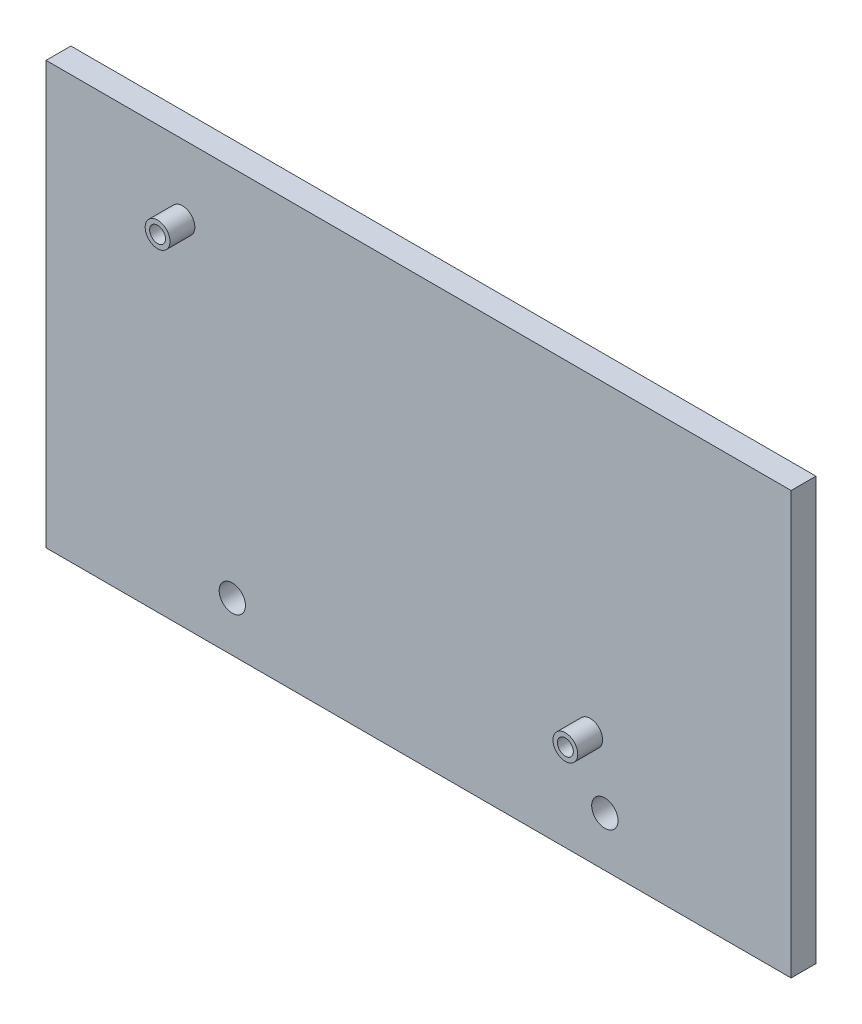
ISO-10303-21;
HEADER;
FILE_DESCRIPTION(('STEP AP214'),'2;1');
FILE_NAME('part.step','',(''),(''),'','','');
FILE_SCHEMA(('AUTOMOTIVE_DESIGN { 1 0 10303 214 1 1 1 1 }'));
ENDSEC;
DATA;
#1=APPLICATION_CONTEXT('core data for automotive mechanical design processes');
#2=APPLICATION_PROTOCOL_DEFINITION('international standard','automotive_design',2000,#1);
#3=PRODUCT_CONTEXT('',#1,'mechanical');
#4=PRODUCT('Part','Part','',(#3));
#5=PRODUCT_RELATED_PRODUCT_CATEGORY('part','',(#4));
#6=PRODUCT_DEFINITION_FORMATION('','',#4);
#7=PRODUCT_DEFINITION_CONTEXT('part definition',#1,'design');
#8=PRODUCT_DEFINITION('design','',#6,#7);
#9=PRODUCT_DEFINITION_SHAPE('','',#8);
#10=(LENGTH_UNIT() NAMED_UNIT(*) SI_UNIT(.MILLI.,.METRE.));
#11=(NAMED_UNIT(*) PLANE_ANGLE_UNIT() SI_UNIT($,.RADIAN.));
#12=(NAMED_UNIT(*) SI_UNIT($,.STERADIAN.) SOLID_ANGLE_UNIT());
#13=UNCERTAINTY_MEASURE_WITH_UNIT(LENGTH_MEASURE(1.E-05),#10,'distance_accuracy_value','');
#14=(GEOMETRIC_REPRESENTATION_CONTEXT(3) GLOBAL_UNCERTAINTY_ASSIGNED_CONTEXT((#13)) GLOBAL_UNIT_ASSIGNED_CONTEXT((#10,
#11,#12)) REPRESENTATION_CONTEXT('',''));
#15=CARTESIAN_POINT('',(0.,0.,0.));
#16=DIRECTION('',(0.,0.,1.));
#17=DIRECTION('',(1.,0.,0.));
#18=AXIS2_PLACEMENT_3D('',#15,#16,#17);
#19=CARTESIAN_POINT('',(109.549409347039,22.54,0.));
#20=DIRECTION('',(0.,0.,1.));
#21=DIRECTION('',(1.,0.,0.));
#22=AXIS2_PLACEMENT_3D('',#19,#20,#21);
#23=CYLINDRICAL_SURFACE('',#22,1.6);
#24=CARTESIAN_POINT('',(109.549409347039,22.54,10.));
#25=DIRECTION('',(0.,0.,1.));
#26=DIRECTION('',(1.,0.,0.));
#27=AXIS2_PLACEMENT_3D('',#24,#25,#26);
#28=CIRCLE('',#27,1.6);
#29=CARTESIAN_POINT('',(111.149409347039,22.54,10.));
#30=VERTEX_POINT('',#29);
#31=EDGE_CURVE('E207',#30,#30,#28,.T.);
#32=ORIENTED_EDGE('',*,*,#31,.T.);
#33=EDGE_LOOP('',(#32));
#34=FACE_BOUND('',#33,.T.);
#35=CARTESIAN_POINT('',(109.549409347039,22.54,3.2));
#36=DIRECTION('',(0.,0.,-1.));
#37=DIRECTION('',(-1.,0.,0.));
#38=AXIS2_PLACEMENT_3D('',#35,#36,#37);
#39=CIRCLE('',#38,1.6);
#40=CARTESIAN_POINT('',(107.949409347039,22.54,3.2));
#41=VERTEX_POINT('',#40);
#42=EDGE_CURVE('E193',#41,#41,#39,.T.);
#43=ORIENTED_EDGE('',*,*,#42,.T.);
#44=EDGE_LOOP('',(#43));
#45=FACE_BOUND('',#44,.T.);
#46=ADVANCED_FACE('F69',(#34,#45),#23,.F.);
#47=CARTESIAN_POINT('',(27.4544,70.8761999999999,0.));
#48=DIRECTION('',(0.,0.,1.));
#49=DIRECTION('',(1.,0.,0.));
#50=AXIS2_PLACEMENT_3D('',#47,#48,#49);
#51=CYLINDRICAL_SURFACE('',#50,1.6);
#52=CARTESIAN_POINT('',(27.4544,70.8761999999999,10.));
#53=DIRECTION('',(0.,0.,1.));
#54=DIRECTION('',(1.,0.,0.));
#55=AXIS2_PLACEMENT_3D('',#52,#53,#54);
#56=CIRCLE('',#55,1.60000000000001);
#57=CARTESIAN_POINT('',(29.0544000000001,70.8761999999999,10.));
#58=VERTEX_POINT('',#57);
#59=EDGE_CURVE('E213',#58,#58,#56,.T.);
#60=ORIENTED_EDGE('',*,*,#59,.T.);
#61=EDGE_LOOP('',(#60));
#62=FACE_BOUND('',#61,.T.);
#63=CARTESIAN_POINT('',(27.4544,70.8761999999999,3.2));
#64=DIRECTION('',(0.,0.,-1.));
#65=DIRECTION('',(-1.,0.,0.));
#66=AXIS2_PLACEMENT_3D('',#63,#64,#65);
#67=CIRCLE('',#66,1.60000000000001);
#68=CARTESIAN_POINT('',(25.8544,70.8761999999999,3.2));
#69=VERTEX_POINT('',#68);
#70=EDGE_CURVE('E197',#69,#69,#67,.T.);
#71=ORIENTED_EDGE('',*,*,#70,.T.);
#72=EDGE_LOOP('',(#71));
#73=FACE_BOUND('',#72,.T.);
#74=ADVANCED_FACE('F158',(#62,#73),#51,.F.);
#75=CARTESIAN_POINT('',(0.,0.,5.));
#76=DIRECTION('',(0.,0.,1.));
#77=DIRECTION('',(1.,0.,0.));
#78=AXIS2_PLACEMENT_3D('',#75,#76,#77);
#79=PLANE('',#78);
#80=CARTESIAN_POINT('',(27.4544,70.8761999999999,5.));
#81=DIRECTION('',(0.,0.,1.));
#82=DIRECTION('',(1.,0.,0.));
#83=AXIS2_PLACEMENT_3D('',#80,#81,#82);
#84=CIRCLE('',#83,2.5);
#85=CARTESIAN_POINT('',(29.9544,70.8761999999999,5.));
#86=VERTEX_POINT('',#85);
#87=EDGE_CURVE('E216',#86,#86,#84,.T.);
#88=ORIENTED_EDGE('',*,*,#87,.F.);
#89=EDGE_LOOP('',(#88));
#90=FACE_BOUND('',#89,.T.);
#91=CARTESIAN_POINT('',(37.5,10.,5.));
#92=DIRECTION('',(0.,0.,1.));
#93=DIRECTION('',(1.,0.,0.));
#94=AXIS2_PLACEMENT_3D('',#91,#92,#93);
#95=CIRCLE('',#94,2.65);
#96=CARTESIAN_POINT('',(40.15,10.,5.));
#97=VERTEX_POINT('',#96);
#98=EDGE_CURVE('E140',#97,#97,#95,.T.);
#99=ORIENTED_EDGE('',*,*,#98,.F.);
#100=EDGE_LOOP('',(#99));
#101=FACE_BOUND('',#100,.T.);
#102=DIRECTION('',(1.,0.,0.));
#103=VECTOR('',#102,1.);
#104=CARTESIAN_POINT('',(0.,85.,5.));
#105=LINE('',#104,#103);
#106=CARTESIAN_POINT('',(0.,85.,5.));
#107=VERTEX_POINT('',#106);
#108=CARTESIAN_POINT('',(150.,85.,5.));
#109=VERTEX_POINT('',#108);
#110=EDGE_CURVE('E129',#107,#109,#105,.T.);
#111=ORIENTED_EDGE('',*,*,#110,.F.);
#112=DIRECTION('',(0.,1.,0.));
#113=VECTOR('',#112,1.);
#114=CARTESIAN_POINT('',(0.,0.,5.));
#115=LINE('',#114,#113);
#116=CARTESIAN_POINT('',(0.,0.,5.));
#117=VERTEX_POINT('',#116);
#118=EDGE_CURVE('E119',#117,#107,#115,.T.);
#119=ORIENTED_EDGE('',*,*,#118,.F.);
#120=DIRECTION('',(1.,0.,0.));
#121=VECTOR('',#120,1.);
#122=CARTESIAN_POINT('',(0.,0.,5.));
#123=LINE('',#122,#121);
#124=CARTESIAN_POINT('',(150.,0.,5.));
#125=VERTEX_POINT('',#124);
#126=EDGE_CURVE('E115',#117,#125,#123,.T.);
#127=ORIENTED_EDGE('',*,*,#126,.T.);
#128=DIRECTION('',(0.,1.,0.));
#129=VECTOR('',#128,1.);
#130=CARTESIAN_POINT('',(150.,0.,5.));
#131=LINE('',#130,#129);
#132=EDGE_CURVE('E112',#125,#109,#131,.T.);
#133=ORIENTED_EDGE('',*,*,#132,.T.);
#134=EDGE_LOOP('',(#111,#119,#127,#133));
#135=FACE_BOUND('',#134,.T.);
#136=CARTESIAN_POINT('',(112.5,10.,5.));
#137=DIRECTION('',(0.,0.,1.));
#138=DIRECTION('',(1.,0.,0.));
#139=AXIS2_PLACEMENT_3D('',#136,#137,#138);
#140=CIRCLE('',#139,2.65);
#141=CARTESIAN_POINT('',(115.15,10.,5.));
#142=VERTEX_POINT('',#141);
#143=EDGE_CURVE('E223',#142,#142,#140,.T.);
#144=ORIENTED_EDGE('',*,*,#143,.F.);
#145=EDGE_LOOP('',(#144));
#146=FACE_BOUND('',#145,.T.);
#147=CARTESIAN_POINT('',(109.549409347039,22.54,5.));
#148=DIRECTION('',(0.,0.,1.));
#149=DIRECTION('',(1.,0.,0.));
#150=AXIS2_PLACEMENT_3D('',#147,#148,#149);
#151=CIRCLE('',#150,2.5);
#152=CARTESIAN_POINT('',(112.049409347039,22.54,5.));
#153=VERTEX_POINT('',#152);
#154=EDGE_CURVE('E204',#153,#153,#151,.T.);
#155=ORIENTED_EDGE('',*,*,#154,.F.);
#156=EDGE_LOOP('',(#155));
#157=FACE_BOUND('',#156,.T.);
#158=ADVANCED_FACE('F117',(#90,#101,#135,#146,#157),#79,.T.);
#159=CARTESIAN_POINT('',(0.,0.,0.));
#160=DIRECTION('',(0.,0.,1.));
#161=DIRECTION('',(1.,0.,0.));
#162=AXIS2_PLACEMENT_3D('',#159,#160,#161);
#163=PLANE('',#162);
#164=CARTESIAN_POINT('',(27.4544,70.8761999999999,0.));
#165=DIRECTION('',(0.,0.,-1.));
#166=DIRECTION('',(-1.,0.,0.));
#167=AXIS2_PLACEMENT_3D('',#164,#165,#166);
#168=CIRCLE('',#167,3.);
#169=CARTESIAN_POINT('',(24.4544,70.8761999999999,0.));
#170=VERTEX_POINT('',#169);
#171=EDGE_CURVE('E188',#170,#170,#168,.T.);
#172=ORIENTED_EDGE('',*,*,#171,.F.);
#173=EDGE_LOOP('',(#172));
#174=FACE_BOUND('',#173,.T.);
#175=CARTESIAN_POINT('',(109.549409347039,22.54,0.));
#176=DIRECTION('',(0.,0.,-1.));
#177=DIRECTION('',(-1.,0.,0.));
#178=AXIS2_PLACEMENT_3D('',#175,#176,#177);
#179=CIRCLE('',#178,3.00000000000001);
#180=CARTESIAN_POINT('',(106.549409347039,22.54,0.));
#181=VERTEX_POINT('',#180);
#182=EDGE_CURVE('E191',#181,#181,#179,.T.);
#183=ORIENTED_EDGE('',*,*,#182,.F.);
#184=EDGE_LOOP('',(#183));
#185=FACE_BOUND('',#184,.T.);
#186=DIRECTION('',(1.,0.,0.));
#187=VECTOR('',#186,1.);
#188=CARTESIAN_POINT('',(0.,85.,0.));
#189=LINE('',#188,#187);
#190=CARTESIAN_POINT('',(0.,85.,0.));
#191=VERTEX_POINT('',#190);
#192=CARTESIAN_POINT('',(150.,85.,0.));
#193=VERTEX_POINT('',#192);
#194=EDGE_CURVE('E136',#191,#193,#189,.T.);
#195=ORIENTED_EDGE('',*,*,#194,.T.);
#196=DIRECTION('',(0.,1.,0.));
#197=VECTOR('',#196,1.);
#198=CARTESIAN_POINT('',(150.,0.,0.));
#199=LINE('',#198,#197);
#200=CARTESIAN_POINT('',(150.,0.,0.));
#201=VERTEX_POINT('',#200);
#202=EDGE_CURVE('E139',#201,#193,#199,.T.);
#203=ORIENTED_EDGE('',*,*,#202,.F.);
#204=DIRECTION('',(1.,0.,0.));
#205=VECTOR('',#204,1.);
#206=CARTESIAN_POINT('',(0.,0.,0.));
#207=LINE('',#206,#205);
#208=CARTESIAN_POINT('',(0.,0.,0.));
#209=VERTEX_POINT('',#208);
#210=EDGE_CURVE('E124',#209,#201,#207,.T.);
#211=ORIENTED_EDGE('',*,*,#210,.F.);
#212=DIRECTION('',(0.,1.,0.));
#213=VECTOR('',#212,1.);
#214=CARTESIAN_POINT('',(0.,0.,0.));
#215=LINE('',#214,#213);
#216=EDGE_CURVE('E131',#209,#191,#215,.T.);
#217=ORIENTED_EDGE('',*,*,#216,.T.);
#218=EDGE_LOOP('',(#195,#203,#211,#217));
#219=FACE_BOUND('',#218,.T.);
#220=CARTESIAN_POINT('',(37.5,10.,0.));
#221=DIRECTION('',(0.,0.,1.));
#222=DIRECTION('',(1.,0.,0.));
#223=AXIS2_PLACEMENT_3D('',#220,#221,#222);
#224=CIRCLE('',#223,2.65);
#225=CARTESIAN_POINT('',(40.15,10.,0.));
#226=VERTEX_POINT('',#225);
#227=EDGE_CURVE('E226',#226,#226,#224,.T.);
#228=ORIENTED_EDGE('',*,*,#227,.T.);
#229=EDGE_LOOP('',(#228));
#230=FACE_BOUND('',#229,.T.);
#231=CARTESIAN_POINT('',(112.5,10.,0.));
#232=DIRECTION('',(0.,0.,1.));
#233=DIRECTION('',(1.,0.,0.));
#234=AXIS2_PLACEMENT_3D('',#231,#232,#233);
#235=CIRCLE('',#234,2.65);
#236=CARTESIAN_POINT('',(115.15,10.,0.));
#237=VERTEX_POINT('',#236);
#238=EDGE_CURVE('E220',#237,#237,#235,.T.);
#239=ORIENTED_EDGE('',*,*,#238,.T.);
#240=EDGE_LOOP('',(#239));
#241=FACE_BOUND('',#240,.T.);
#242=ADVANCED_FACE('F146',(#174,#185,#219,#230,#241),#163,.F.);
#243=CARTESIAN_POINT('',(0.,85.,5.));
#244=DIRECTION('',(0.,1.,0.));
#245=DIRECTION('',(0.,0.,1.));
#246=AXIS2_PLACEMENT_3D('',#243,#244,#245);
#247=PLANE('',#246);
#248=ORIENTED_EDGE('',*,*,#194,.F.);
#249=DIRECTION('',(0.,0.,-1.));
#250=VECTOR('',#249,1.);
#251=CARTESIAN_POINT('',(0.,85.,5.));
#252=LINE('',#251,#250);
#253=EDGE_CURVE('E12',#107,#191,#252,.T.);
#254=ORIENTED_EDGE('',*,*,#253,.F.);
#255=ORIENTED_EDGE('',*,*,#110,.T.);
#256=DIRECTION('',(0.,0.,-1.));
#257=VECTOR('',#256,1.);
#258=CARTESIAN_POINT('',(150.,85.,5.));
#259=LINE('',#258,#257);
#260=EDGE_CURVE('E73',#109,#193,#259,.T.);
#261=ORIENTED_EDGE('',*,*,#260,.T.);
#262=EDGE_LOOP('',(#248,#254,#255,#261));
#263=FACE_BOUND('',#262,.T.);
#264=ADVANCED_FACE('F71',(#263),#247,.T.);
#265=CARTESIAN_POINT('',(0.,0.,5.));
#266=DIRECTION('',(-1.,0.,0.));
#267=DIRECTION('',(0.,0.,1.));
#268=AXIS2_PLACEMENT_3D('',#265,#266,#267);
#269=PLANE('',#268);
#270=ORIENTED_EDGE('',*,*,#216,.F.);
#271=DIRECTION('',(0.,0.,-1.));
#272=VECTOR('',#271,1.);
#273=CARTESIAN_POINT('',(0.,0.,5.));
#274=LINE('',#273,#272);
#275=EDGE_CURVE('E79',#117,#209,#274,.T.);
#276=ORIENTED_EDGE('',*,*,#275,.F.);
#277=ORIENTED_EDGE('',*,*,#118,.T.);
#278=ORIENTED_EDGE('',*,*,#253,.T.);
#279=EDGE_LOOP('',(#270,#276,#277,#278));
#280=FACE_BOUND('',#279,.T.);
#281=ADVANCED_FACE('F148',(#280),#269,.T.);
#282=CARTESIAN_POINT('',(0.,0.,5.));
#283=DIRECTION('',(0.,1.,0.));
#284=DIRECTION('',(0.,0.,1.));
#285=AXIS2_PLACEMENT_3D('',#282,#283,#284);
#286=PLANE('',#285);
#287=ORIENTED_EDGE('',*,*,#210,.T.);
#288=DIRECTION('',(0.,0.,-1.));
#289=VECTOR('',#288,1.);
#290=CARTESIAN_POINT('',(150.,0.,5.));
#291=LINE('',#290,#289);
#292=EDGE_CURVE('E122',#125,#201,#291,.T.);
#293=ORIENTED_EDGE('',*,*,#292,.F.);
#294=ORIENTED_EDGE('',*,*,#126,.F.);
#295=ORIENTED_EDGE('',*,*,#275,.T.);
#296=EDGE_LOOP('',(#287,#293,#294,#295));
#297=FACE_BOUND('',#296,.T.);
#298=ADVANCED_FACE('F123',(#297),#286,.F.);
#299=CARTESIAN_POINT('',(150.,0.,5.));
#300=DIRECTION('',(-1.,0.,0.));
#301=DIRECTION('',(0.,0.,1.));
#302=AXIS2_PLACEMENT_3D('',#299,#300,#301);
#303=PLANE('',#302);
#304=ORIENTED_EDGE('',*,*,#202,.T.);
#305=ORIENTED_EDGE('',*,*,#260,.F.);
#306=ORIENTED_EDGE('',*,*,#132,.F.);
#307=ORIENTED_EDGE('',*,*,#292,.T.);
#308=EDGE_LOOP('',(#304,#305,#306,#307));
#309=FACE_BOUND('',#308,.T.);
#310=ADVANCED_FACE('F128',(#309),#303,.F.);
#311=CARTESIAN_POINT('',(37.5,10.,5.));
#312=DIRECTION('',(0.,0.,-1.));
#313=DIRECTION('',(-1.,0.,0.));
#314=AXIS2_PLACEMENT_3D('',#311,#312,#313);
#315=CYLINDRICAL_SURFACE('',#314,2.65);
#316=ORIENTED_EDGE('',*,*,#98,.T.);
#317=EDGE_LOOP('',(#316));
#318=FACE_BOUND('',#317,.T.);
#319=ORIENTED_EDGE('',*,*,#227,.F.);
#320=EDGE_LOOP('',(#319));
#321=FACE_BOUND('',#320,.T.);
#322=ADVANCED_FACE('F174',(#318,#321),#315,.F.);
#323=CARTESIAN_POINT('',(112.5,10.,5.));
#324=DIRECTION('',(0.,0.,-1.));
#325=DIRECTION('',(-1.,0.,0.));
#326=AXIS2_PLACEMENT_3D('',#323,#324,#325);
#327=CYLINDRICAL_SURFACE('',#326,2.65);
#328=ORIENTED_EDGE('',*,*,#143,.T.);
#329=EDGE_LOOP('',(#328));
#330=FACE_BOUND('',#329,.T.);
#331=ORIENTED_EDGE('',*,*,#238,.F.);
#332=EDGE_LOOP('',(#331));
#333=FACE_BOUND('',#332,.T.);
#334=ADVANCED_FACE('F170',(#330,#333),#327,.F.);
#335=CARTESIAN_POINT('',(27.4544,70.8761999999999,10.));
#336=DIRECTION('',(0.,0.,1.));
#337=DIRECTION('',(1.,0.,0.));
#338=AXIS2_PLACEMENT_3D('',#335,#336,#337);
#339=PLANE('',#338);
#340=CARTESIAN_POINT('',(27.4544,70.8761999999999,10.));
#341=DIRECTION('',(0.,0.,1.));
#342=DIRECTION('',(1.,0.,0.));
#343=AXIS2_PLACEMENT_3D('',#340,#341,#342);
#344=CIRCLE('',#343,2.5);
#345=CARTESIAN_POINT('',(29.9544,70.8761999999999,10.));
#346=VERTEX_POINT('',#345);
#347=EDGE_CURVE('E217',#346,#346,#344,.T.);
#348=ORIENTED_EDGE('',*,*,#347,.T.);
#349=EDGE_LOOP('',(#348));
#350=FACE_BOUND('',#349,.T.);
#351=ORIENTED_EDGE('',*,*,#59,.F.);
#352=EDGE_LOOP('',(#351));
#353=FACE_BOUND('',#352,.T.);
#354=ADVANCED_FACE('F173',(#350,#353),#339,.T.);
#355=CARTESIAN_POINT('',(27.4544,70.8761999999999,10.));
#356=DIRECTION('',(0.,0.,-1.));
#357=DIRECTION('',(-1.,0.,0.));
#358=AXIS2_PLACEMENT_3D('',#355,#356,#357);
#359=CYLINDRICAL_SURFACE('',#358,2.5);
#360=ORIENTED_EDGE('',*,*,#347,.F.);
#361=EDGE_LOOP('',(#360));
#362=FACE_BOUND('',#361,.T.);
#363=ORIENTED_EDGE('',*,*,#87,.T.);
#364=EDGE_LOOP('',(#363));
#365=FACE_BOUND('',#364,.T.);
#366=ADVANCED_FACE('F255',(#362,#365),#359,.T.);
#367=CARTESIAN_POINT('',(109.549409347039,22.54,10.));
#368=DIRECTION('',(0.,0.,1.));
#369=DIRECTION('',(1.,0.,0.));
#370=AXIS2_PLACEMENT_3D('',#367,#368,#369);
#371=PLANE('',#370);
#372=CARTESIAN_POINT('',(109.549409347039,22.54,10.));
#373=DIRECTION('',(0.,0.,1.));
#374=DIRECTION('',(1.,0.,0.));
#375=AXIS2_PLACEMENT_3D('',#372,#373,#374);
#376=CIRCLE('',#375,2.5);
#377=CARTESIAN_POINT('',(112.049409347039,22.54,10.));
#378=VERTEX_POINT('',#377);
#379=EDGE_CURVE('E208',#378,#378,#376,.T.);
#380=ORIENTED_EDGE('',*,*,#379,.T.);
#381=EDGE_LOOP('',(#380));
#382=FACE_BOUND('',#381,.T.);
#383=ORIENTED_EDGE('',*,*,#31,.F.);
#384=EDGE_LOOP('',(#383));
#385=FACE_BOUND('',#384,.T.);
#386=ADVANCED_FACE('F245',(#382,#385),#371,.T.);
#387=CARTESIAN_POINT('',(109.549409347039,22.54,10.));
#388=DIRECTION('',(0.,0.,-1.));
#389=DIRECTION('',(-1.,0.,0.));
#390=AXIS2_PLACEMENT_3D('',#387,#388,#389);
#391=CYLINDRICAL_SURFACE('',#390,2.5);
#392=ORIENTED_EDGE('',*,*,#379,.F.);
#393=EDGE_LOOP('',(#392));
#394=FACE_BOUND('',#393,.T.);
#395=ORIENTED_EDGE('',*,*,#154,.T.);
#396=EDGE_LOOP('',(#395));
#397=FACE_BOUND('',#396,.T.);
#398=ADVANCED_FACE('F242',(#394,#397),#391,.T.);
#399=CARTESIAN_POINT('',(27.4544,70.8761999999999,3.2));
#400=DIRECTION('',(0.,0.,-1.));
#401=DIRECTION('',(-1.,0.,0.));
#402=AXIS2_PLACEMENT_3D('',#399,#400,#401);
#403=CYLINDRICAL_SURFACE('',#402,3.);
#404=CARTESIAN_POINT('',(27.4544,70.8761999999999,3.2));
#405=DIRECTION('',(0.,0.,-1.));
#406=DIRECTION('',(-1.,0.,0.));
#407=AXIS2_PLACEMENT_3D('',#404,#405,#406);
#408=CIRCLE('',#407,3.);
#409=CARTESIAN_POINT('',(24.4544,70.8761999999999,3.2));
#410=VERTEX_POINT('',#409);
#411=EDGE_CURVE('E211',#410,#410,#408,.T.);
#412=ORIENTED_EDGE('',*,*,#411,.F.);
#413=EDGE_LOOP('',(#412));
#414=FACE_BOUND('',#413,.T.);
#415=ORIENTED_EDGE('',*,*,#171,.T.);
#416=EDGE_LOOP('',(#415));
#417=FACE_BOUND('',#416,.T.);
#418=ADVANCED_FACE('F244',(#414,#417),#403,.F.);
#419=CARTESIAN_POINT('',(27.4544,70.8761999999999,3.2));
#420=DIRECTION('',(0.,0.,-1.));
#421=DIRECTION('',(-1.,0.,0.));
#422=AXIS2_PLACEMENT_3D('',#419,#420,#421);
#423=PLANE('',#422);
#424=ORIENTED_EDGE('',*,*,#70,.F.);
#425=EDGE_LOOP('',(#424));
#426=FACE_BOUND('',#425,.T.);
#427=ORIENTED_EDGE('',*,*,#411,.T.);
#428=EDGE_LOOP('',(#427));
#429=FACE_BOUND('',#428,.T.);
#430=ADVANCED_FACE('F252',(#426,#429),#423,.T.);
#431=CARTESIAN_POINT('',(109.549409347039,22.54,3.2));
#432=DIRECTION('',(0.,0.,-1.));
#433=DIRECTION('',(-1.,0.,0.));
#434=AXIS2_PLACEMENT_3D('',#431,#432,#433);
#435=CYLINDRICAL_SURFACE('',#434,3.00000000000001);
#436=CARTESIAN_POINT('',(109.549409347039,22.54,3.2));
#437=DIRECTION('',(0.,0.,-1.));
#438=DIRECTION('',(-1.,0.,0.));
#439=AXIS2_PLACEMENT_3D('',#436,#437,#438);
#440=CIRCLE('',#439,3.00000000000001);
#441=CARTESIAN_POINT('',(106.549409347039,22.54,3.2));
#442=VERTEX_POINT('',#441);
#443=EDGE_CURVE('E194',#442,#442,#440,.T.);
#444=ORIENTED_EDGE('',*,*,#443,.F.);
#445=EDGE_LOOP('',(#444));
#446=FACE_BOUND('',#445,.T.);
#447=ORIENTED_EDGE('',*,*,#182,.T.);
#448=EDGE_LOOP('',(#447));
#449=FACE_BOUND('',#448,.T.);
#450=ADVANCED_FACE('F284',(#446,#449),#435,.F.);
#451=CARTESIAN_POINT('',(109.549409347039,22.54,3.2));
#452=DIRECTION('',(0.,0.,-1.));
#453=DIRECTION('',(-1.,0.,0.));
#454=AXIS2_PLACEMENT_3D('',#451,#452,#453);
#455=PLANE('',#454);
#456=ORIENTED_EDGE('',*,*,#42,.F.);
#457=EDGE_LOOP('',(#456));
#458=FACE_BOUND('',#457,.T.);
#459=ORIENTED_EDGE('',*,*,#443,.T.);
#460=EDGE_LOOP('',(#459));
#461=FACE_BOUND('',#460,.T.);
#462=ADVANCED_FACE('F260',(#458,#461),#455,.T.);
#463=CLOSED_SHELL('',(#46,#74,#158,#242,#264,#281,#298,#310,#322,#334,#354,#366,#386,#398,#418,
#430,#450,#462));
#464=MANIFOLD_SOLID_BREP('B2',#463);
#465=ADVANCED_BREP_SHAPE_REPRESENTATION('',(#18,#464),#14);
#466=SHAPE_DEFINITION_REPRESENTATION(#9,#465);
ENDSEC;
END-ISO-10303-21;
